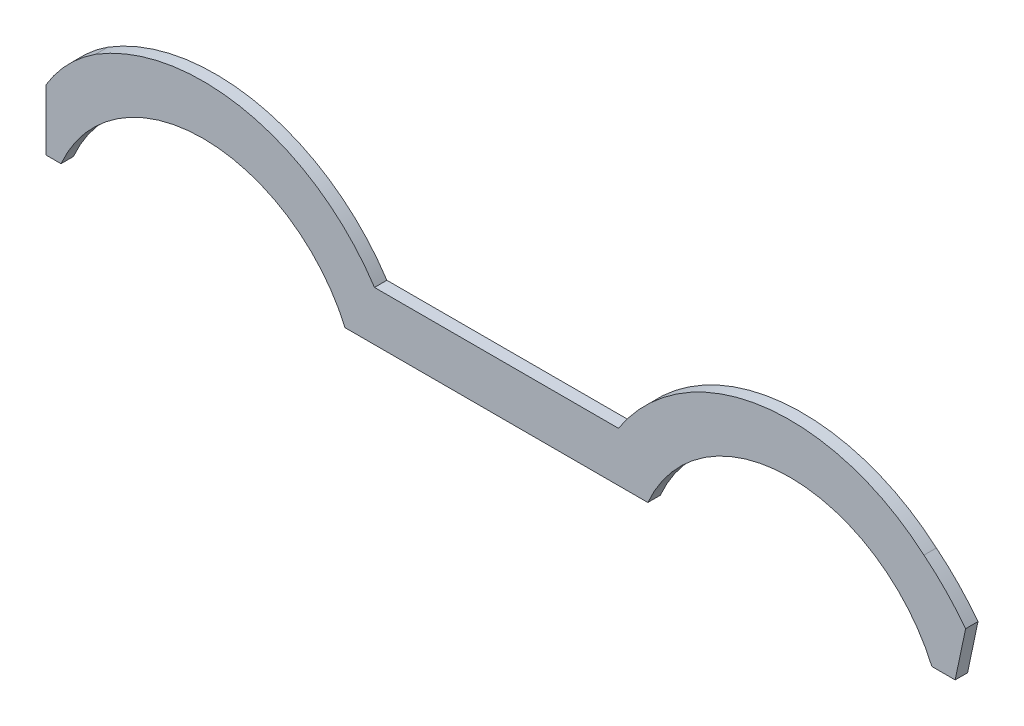
ISO-10303-21;
HEADER;
FILE_DESCRIPTION(('STEP AP214'),'2;1');
FILE_NAME('part.step','',(''),(''),'','','');
FILE_SCHEMA(('AUTOMOTIVE_DESIGN { 1 0 10303 214 1 1 1 1 }'));
ENDSEC;
DATA;
#1=APPLICATION_CONTEXT('core data for automotive mechanical design processes');
#2=APPLICATION_PROTOCOL_DEFINITION('international standard','automotive_design',2000,#1);
#3=PRODUCT_CONTEXT('',#1,'mechanical');
#4=PRODUCT('Part','Part','',(#3));
#5=PRODUCT_RELATED_PRODUCT_CATEGORY('part','',(#4));
#6=PRODUCT_DEFINITION_FORMATION('','',#4);
#7=PRODUCT_DEFINITION_CONTEXT('part definition',#1,'design');
#8=PRODUCT_DEFINITION('design','',#6,#7);
#9=PRODUCT_DEFINITION_SHAPE('','',#8);
#10=(LENGTH_UNIT() NAMED_UNIT(*) SI_UNIT(.MILLI.,.METRE.));
#11=(NAMED_UNIT(*) PLANE_ANGLE_UNIT() SI_UNIT($,.RADIAN.));
#12=(NAMED_UNIT(*) SI_UNIT($,.STERADIAN.) SOLID_ANGLE_UNIT());
#13=UNCERTAINTY_MEASURE_WITH_UNIT(LENGTH_MEASURE(1.E-05),#10,'distance_accuracy_value','');
#14=(GEOMETRIC_REPRESENTATION_CONTEXT(3) GLOBAL_UNCERTAINTY_ASSIGNED_CONTEXT((#13)) GLOBAL_UNIT_ASSIGNED_CONTEXT((#10,
#11,#12)) REPRESENTATION_CONTEXT('',''));
#15=CARTESIAN_POINT('',(0.,0.,0.));
#16=DIRECTION('',(0.,0.,1.));
#17=DIRECTION('',(1.,0.,0.));
#18=AXIS2_PLACEMENT_3D('',#15,#16,#17);
#19=CARTESIAN_POINT('',(-187.525673187149,-4.70490413530697,3.));
#20=DIRECTION('',(0.,0.,-1.));
#21=DIRECTION('',(-1.,0.,0.));
#22=AXIS2_PLACEMENT_3D('',#19,#20,#21);
#23=CYLINDRICAL_SURFACE('',#22,37.8436276046482);
#24=CARTESIAN_POINT('',(-187.525673187149,-4.70490413530697,0.));
#25=DIRECTION('',(0.,0.,1.));
#26=DIRECTION('',(1.,0.,0.));
#27=AXIS2_PLACEMENT_3D('',#24,#25,#26);
#28=CIRCLE('',#27,37.8436276046482);
#29=CARTESIAN_POINT('',(-208.,27.1218470630147,0.));
#30=VERTEX_POINT('',#29);
#31=CARTESIAN_POINT('',(-220.,14.7259540117603,0.));
#32=VERTEX_POINT('',#31);
#33=EDGE_CURVE('E159',#30,#32,#28,.T.);
#34=ORIENTED_EDGE('',*,*,#33,.T.);
#35=DIRECTION('',(0.,0.,-1.));
#36=VECTOR('',#35,1.);
#37=CARTESIAN_POINT('',(-220.,14.7259540117603,3.));
#38=LINE('',#37,#36);
#39=CARTESIAN_POINT('',(-220.,14.7259540117603,3.));
#40=VERTEX_POINT('',#39);
#41=EDGE_CURVE('E11',#40,#32,#38,.T.);
#42=ORIENTED_EDGE('',*,*,#41,.F.);
#43=CARTESIAN_POINT('',(-187.525673187149,-4.70490413530697,3.));
#44=DIRECTION('',(0.,0.,1.));
#45=DIRECTION('',(1.,0.,0.));
#46=AXIS2_PLACEMENT_3D('',#43,#44,#45);
#47=CIRCLE('',#46,37.8436276046482);
#48=CARTESIAN_POINT('',(-208.,27.1218470630147,3.));
#49=VERTEX_POINT('',#48);
#50=EDGE_CURVE('E181',#49,#40,#47,.T.);
#51=ORIENTED_EDGE('',*,*,#50,.F.);
#52=DIRECTION('',(0.,0.,-1.));
#53=VECTOR('',#52,1.);
#54=CARTESIAN_POINT('',(-208.,27.1218470630147,3.));
#55=LINE('',#54,#53);
#56=EDGE_CURVE('E155',#49,#30,#55,.T.);
#57=ORIENTED_EDGE('',*,*,#56,.T.);
#58=EDGE_LOOP('',(#34,#42,#51,#57));
#59=FACE_BOUND('',#58,.T.);
#60=ADVANCED_FACE('F39',(#59),#23,.T.);
#61=CARTESIAN_POINT('',(-220.,0.,3.));
#62=DIRECTION('',(1.,0.,0.));
#63=DIRECTION('',(0.,0.,-1.));
#64=AXIS2_PLACEMENT_3D('',#61,#62,#63);
#65=PLANE('',#64);
#66=DIRECTION('',(0.,-1.,0.));
#67=VECTOR('',#66,1.);
#68=CARTESIAN_POINT('',(-220.,0.,0.));
#69=LINE('',#68,#67);
#70=CARTESIAN_POINT('',(-220.,0.,0.));
#71=VERTEX_POINT('',#70);
#72=EDGE_CURVE('E162',#32,#71,#69,.T.);
#73=ORIENTED_EDGE('',*,*,#72,.T.);
#74=DIRECTION('',(0.,0.,-1.));
#75=VECTOR('',#74,1.);
#76=CARTESIAN_POINT('',(-220.,0.,3.));
#77=LINE('',#76,#75);
#78=CARTESIAN_POINT('',(-220.,0.,3.));
#79=VERTEX_POINT('',#78);
#80=EDGE_CURVE('E47',#79,#71,#77,.T.);
#81=ORIENTED_EDGE('',*,*,#80,.F.);
#82=DIRECTION('',(0.,-1.,0.));
#83=VECTOR('',#82,1.);
#84=CARTESIAN_POINT('',(-220.,0.,3.));
#85=LINE('',#84,#83);
#86=EDGE_CURVE('E110',#40,#79,#85,.T.);
#87=ORIENTED_EDGE('',*,*,#86,.F.);
#88=ORIENTED_EDGE('',*,*,#41,.T.);
#89=EDGE_LOOP('',(#73,#81,#87,#88));
#90=FACE_BOUND('',#89,.T.);
#91=ADVANCED_FACE('F259',(#90),#65,.F.);
#92=CARTESIAN_POINT('',(-216.369317712169,0.,3.));
#93=DIRECTION('',(0.,1.,0.));
#94=DIRECTION('',(-1.,0.,0.));
#95=AXIS2_PLACEMENT_3D('',#92,#93,#94);
#96=PLANE('',#95);
#97=DIRECTION('',(1.,0.,0.));
#98=VECTOR('',#97,1.);
#99=CARTESIAN_POINT('',(-216.369317712169,0.,0.));
#100=LINE('',#99,#98);
#101=CARTESIAN_POINT('',(-216.369317712169,0.,0.));
#102=VERTEX_POINT('',#101);
#103=EDGE_CURVE('E164',#71,#102,#100,.T.);
#104=ORIENTED_EDGE('',*,*,#103,.T.);
#105=DIRECTION('',(0.,0.,-1.));
#106=VECTOR('',#105,1.);
#107=CARTESIAN_POINT('',(-216.369317712169,0.,3.));
#108=LINE('',#107,#106);
#109=CARTESIAN_POINT('',(-216.369317712169,0.,3.));
#110=VERTEX_POINT('',#109);
#111=EDGE_CURVE('E200',#110,#102,#108,.T.);
#112=ORIENTED_EDGE('',*,*,#111,.F.);
#113=DIRECTION('',(1.,0.,0.));
#114=VECTOR('',#113,1.);
#115=CARTESIAN_POINT('',(-216.369317712169,0.,3.));
#116=LINE('',#115,#114);
#117=EDGE_CURVE('E208',#79,#110,#116,.T.);
#118=ORIENTED_EDGE('',*,*,#117,.F.);
#119=ORIENTED_EDGE('',*,*,#80,.T.);
#120=EDGE_LOOP('',(#104,#112,#118,#119));
#121=FACE_BOUND('',#120,.T.);
#122=ADVANCED_FACE('F206',(#121),#96,.F.);
#123=CARTESIAN_POINT('',(-182.,-15.,3.));
#124=DIRECTION('',(0.,0.,-1.));
#125=DIRECTION('',(-1.,0.,0.));
#126=AXIS2_PLACEMENT_3D('',#123,#124,#125);
#127=CYLINDRICAL_SURFACE('',#126,37.5);
#128=CARTESIAN_POINT('',(-182.,-15.,0.));
#129=DIRECTION('',(0.,0.,-1.));
#130=DIRECTION('',(1.,0.,0.));
#131=AXIS2_PLACEMENT_3D('',#128,#129,#130);
#132=CIRCLE('',#131,37.5);
#133=CARTESIAN_POINT('',(-147.630682287831,0.,0.));
#134=VERTEX_POINT('',#133);
#135=EDGE_CURVE('E166',#102,#134,#132,.T.);
#136=ORIENTED_EDGE('',*,*,#135,.T.);
#137=DIRECTION('',(0.,0.,-1.));
#138=VECTOR('',#137,1.);
#139=CARTESIAN_POINT('',(-147.630682287831,0.,3.));
#140=LINE('',#139,#138);
#141=CARTESIAN_POINT('',(-147.630682287831,0.,3.));
#142=VERTEX_POINT('',#141);
#143=EDGE_CURVE('E197',#142,#134,#140,.T.);
#144=ORIENTED_EDGE('',*,*,#143,.F.);
#145=CARTESIAN_POINT('',(-182.,-15.,3.));
#146=DIRECTION('',(0.,0.,-1.));
#147=DIRECTION('',(1.,0.,0.));
#148=AXIS2_PLACEMENT_3D('',#145,#146,#147);
#149=CIRCLE('',#148,37.5);
#150=EDGE_CURVE('E226',#110,#142,#149,.T.);
#151=ORIENTED_EDGE('',*,*,#150,.F.);
#152=ORIENTED_EDGE('',*,*,#111,.T.);
#153=EDGE_LOOP('',(#136,#144,#151,#152));
#154=FACE_BOUND('',#153,.T.);
#155=ADVANCED_FACE('F217',(#154),#127,.F.);
#156=CARTESIAN_POINT('',(-74.3693177121688,0.,3.));
#157=DIRECTION('',(0.,1.,0.));
#158=DIRECTION('',(-1.,0.,0.));
#159=AXIS2_PLACEMENT_3D('',#156,#157,#158);
#160=PLANE('',#159);
#161=DIRECTION('',(1.,0.,0.));
#162=VECTOR('',#161,1.);
#163=CARTESIAN_POINT('',(-74.3693177121688,0.,0.));
#164=LINE('',#163,#162);
#165=CARTESIAN_POINT('',(-74.3693177121688,0.,0.));
#166=VERTEX_POINT('',#165);
#167=EDGE_CURVE('E168',#134,#166,#164,.T.);
#168=ORIENTED_EDGE('',*,*,#167,.T.);
#169=DIRECTION('',(0.,0.,-1.));
#170=VECTOR('',#169,1.);
#171=CARTESIAN_POINT('',(-74.3693177121688,0.,3.));
#172=LINE('',#171,#170);
#173=CARTESIAN_POINT('',(-74.3693177121688,0.,3.));
#174=VERTEX_POINT('',#173);
#175=EDGE_CURVE('E194',#174,#166,#172,.T.);
#176=ORIENTED_EDGE('',*,*,#175,.F.);
#177=DIRECTION('',(1.,0.,0.));
#178=VECTOR('',#177,1.);
#179=CARTESIAN_POINT('',(-74.3693177121688,0.,3.));
#180=LINE('',#179,#178);
#181=EDGE_CURVE('E223',#142,#174,#180,.T.);
#182=ORIENTED_EDGE('',*,*,#181,.F.);
#183=ORIENTED_EDGE('',*,*,#143,.T.);
#184=EDGE_LOOP('',(#168,#176,#182,#183));
#185=FACE_BOUND('',#184,.T.);
#186=ADVANCED_FACE('F221',(#185),#160,.F.);
#187=CARTESIAN_POINT('',(-40.,-15.,3.));
#188=DIRECTION('',(0.,0.,-1.));
#189=DIRECTION('',(-1.,0.,0.));
#190=AXIS2_PLACEMENT_3D('',#187,#188,#189);
#191=CYLINDRICAL_SURFACE('',#190,37.5);
#192=CARTESIAN_POINT('',(-40.,-15.,0.));
#193=DIRECTION('',(0.,0.,-1.));
#194=DIRECTION('',(1.,0.,0.));
#195=AXIS2_PLACEMENT_3D('',#192,#193,#194);
#196=CIRCLE('',#195,37.5);
#197=CARTESIAN_POINT('',(-5.63068228783117,0.,0.));
#198=VERTEX_POINT('',#197);
#199=EDGE_CURVE('E170',#166,#198,#196,.T.);
#200=ORIENTED_EDGE('',*,*,#199,.T.);
#201=DIRECTION('',(0.,0.,-1.));
#202=VECTOR('',#201,1.);
#203=CARTESIAN_POINT('',(-5.63068228783117,0.,3.));
#204=LINE('',#203,#202);
#205=CARTESIAN_POINT('',(-5.63068228783117,0.,3.));
#206=VERTEX_POINT('',#205);
#207=EDGE_CURVE('E191',#206,#198,#204,.T.);
#208=ORIENTED_EDGE('',*,*,#207,.F.);
#209=CARTESIAN_POINT('',(-40.,-15.,3.));
#210=DIRECTION('',(0.,0.,-1.));
#211=DIRECTION('',(1.,0.,0.));
#212=AXIS2_PLACEMENT_3D('',#209,#210,#211);
#213=CIRCLE('',#212,37.5);
#214=EDGE_CURVE('E225',#174,#206,#213,.T.);
#215=ORIENTED_EDGE('',*,*,#214,.F.);
#216=ORIENTED_EDGE('',*,*,#175,.T.);
#217=EDGE_LOOP('',(#200,#208,#215,#216));
#218=FACE_BOUND('',#217,.T.);
#219=ADVANCED_FACE('F272',(#218),#191,.F.);
#220=CARTESIAN_POINT('',(-5.63068228783117,0.,3.));
#221=DIRECTION('',(0.,1.,0.));
#222=DIRECTION('',(0.,0.,1.));
#223=AXIS2_PLACEMENT_3D('',#220,#221,#222);
#224=PLANE('',#223);
#225=DIRECTION('',(1.,0.,0.));
#226=VECTOR('',#225,1.);
#227=CARTESIAN_POINT('',(-5.63068228783117,0.,0.));
#228=LINE('',#227,#226);
#229=CARTESIAN_POINT('',(0.,0.,0.));
#230=VERTEX_POINT('',#229);
#231=EDGE_CURVE('E172',#198,#230,#228,.T.);
#232=ORIENTED_EDGE('',*,*,#231,.T.);
#233=DIRECTION('',(0.,0.,-1.));
#234=VECTOR('',#233,1.);
#235=CARTESIAN_POINT('',(0.,0.,3.));
#236=LINE('',#235,#234);
#237=CARTESIAN_POINT('',(0.,0.,3.));
#238=VERTEX_POINT('',#237);
#239=EDGE_CURVE('E188',#238,#230,#236,.T.);
#240=ORIENTED_EDGE('',*,*,#239,.F.);
#241=DIRECTION('',(1.,0.,0.));
#242=VECTOR('',#241,1.);
#243=CARTESIAN_POINT('',(-5.63068228783117,0.,3.));
#244=LINE('',#243,#242);
#245=EDGE_CURVE('E228',#206,#238,#244,.T.);
#246=ORIENTED_EDGE('',*,*,#245,.F.);
#247=ORIENTED_EDGE('',*,*,#207,.T.);
#248=EDGE_LOOP('',(#232,#240,#246,#247));
#249=FACE_BOUND('',#248,.T.);
#250=ADVANCED_FACE('F275',(#249),#224,.F.);
#251=CARTESIAN_POINT('',(0.,0.,3.));
#252=DIRECTION('',(-0.978525064775294,0.20612786712744,0.));
#253=DIRECTION('',(-0.20612786712744,-0.978525064775294,0.));
#254=AXIS2_PLACEMENT_3D('',#251,#252,#253);
#255=PLANE('',#254);
#256=DIRECTION('',(0.20612786712744,0.978525064775294,0.));
#257=VECTOR('',#256,1.);
#258=CARTESIAN_POINT('',(0.,0.,0.));
#259=LINE('',#258,#257);
#260=CARTESIAN_POINT('',(2.52781915821164,12.,0.));
#261=VERTEX_POINT('',#260);
#262=EDGE_CURVE('E174',#230,#261,#259,.T.);
#263=ORIENTED_EDGE('',*,*,#262,.T.);
#264=DIRECTION('',(0.,0.,-1.));
#265=VECTOR('',#264,1.);
#266=CARTESIAN_POINT('',(2.52781915821164,12.,3.));
#267=LINE('',#266,#265);
#268=CARTESIAN_POINT('',(2.52781915821164,12.,3.));
#269=VERTEX_POINT('',#268);
#270=EDGE_CURVE('E185',#269,#261,#267,.T.);
#271=ORIENTED_EDGE('',*,*,#270,.F.);
#272=DIRECTION('',(0.20612786712744,0.978525064775294,0.));
#273=VECTOR('',#272,1.);
#274=CARTESIAN_POINT('',(0.,0.,3.));
#275=LINE('',#274,#273);
#276=EDGE_CURVE('E234',#238,#269,#275,.T.);
#277=ORIENTED_EDGE('',*,*,#276,.F.);
#278=ORIENTED_EDGE('',*,*,#239,.T.);
#279=EDGE_LOOP('',(#263,#271,#277,#278));
#280=FACE_BOUND('',#279,.T.);
#281=ADVANCED_FACE('F240',(#280),#255,.F.);
#282=CARTESIAN_POINT('',(-44.9702334529333,-24.0343196837824,3.));
#283=DIRECTION('',(0.,0.,-1.));
#284=DIRECTION('',(-1.,0.,0.));
#285=AXIS2_PLACEMENT_3D('',#282,#283,#284);
#286=CYLINDRICAL_SURFACE('',#285,59.6199395917516);
#287=CARTESIAN_POINT('',(-44.9702334529333,-24.0343196837824,0.));
#288=DIRECTION('',(0.,0.,1.));
#289=DIRECTION('',(-1.,0.,0.));
#290=AXIS2_PLACEMENT_3D('',#287,#288,#289);
#291=CIRCLE('',#290,59.6199395917516);
#292=CARTESIAN_POINT('',(-7.54917120365112,22.3790544346705,0.));
#293=VERTEX_POINT('',#292);
#294=EDGE_CURVE('E176',#261,#293,#291,.T.);
#295=ORIENTED_EDGE('',*,*,#294,.T.);
#296=DIRECTION('',(0.,0.,-1.));
#297=VECTOR('',#296,1.);
#298=CARTESIAN_POINT('',(-7.54917120365112,22.3790544346705,3.));
#299=LINE('',#298,#297);
#300=CARTESIAN_POINT('',(-7.54917120365112,22.3790544346705,3.));
#301=VERTEX_POINT('',#300);
#302=EDGE_CURVE('E150',#301,#293,#299,.T.);
#303=ORIENTED_EDGE('',*,*,#302,.F.);
#304=CARTESIAN_POINT('',(-44.9702334529333,-24.0343196837824,3.));
#305=DIRECTION('',(0.,0.,1.));
#306=DIRECTION('',(-1.,0.,0.));
#307=AXIS2_PLACEMENT_3D('',#304,#305,#306);
#308=CIRCLE('',#307,59.6199395917516);
#309=EDGE_CURVE('E141',#269,#301,#308,.T.);
#310=ORIENTED_EDGE('',*,*,#309,.F.);
#311=ORIENTED_EDGE('',*,*,#270,.T.);
#312=EDGE_LOOP('',(#295,#303,#310,#311));
#313=FACE_BOUND('',#312,.T.);
#314=ADVANCED_FACE('F244',(#313),#286,.T.);
#315=CARTESIAN_POINT('',(-40.,-15.,3.));
#316=DIRECTION('',(0.,0.,-1.));
#317=DIRECTION('',(-1.,0.,0.));
#318=AXIS2_PLACEMENT_3D('',#315,#316,#317);
#319=CYLINDRICAL_SURFACE('',#318,49.5);
#320=CARTESIAN_POINT('',(-40.,-15.,0.));
#321=DIRECTION('',(0.,0.,1.));
#322=DIRECTION('',(1.,0.,0.));
#323=AXIS2_PLACEMENT_3D('',#320,#321,#322);
#324=CIRCLE('',#323,49.5);
#325=CARTESIAN_POINT('',(-81.487950057818,12.,0.));
#326=VERTEX_POINT('',#325);
#327=EDGE_CURVE('E149',#293,#326,#324,.T.);
#328=ORIENTED_EDGE('',*,*,#327,.T.);
#329=DIRECTION('',(0.,0.,-1.));
#330=VECTOR('',#329,1.);
#331=CARTESIAN_POINT('',(-81.487950057818,12.,3.));
#332=LINE('',#331,#330);
#333=CARTESIAN_POINT('',(-81.487950057818,12.,3.));
#334=VERTEX_POINT('',#333);
#335=EDGE_CURVE('E146',#334,#326,#332,.T.);
#336=ORIENTED_EDGE('',*,*,#335,.F.);
#337=CARTESIAN_POINT('',(-40.,-15.,3.));
#338=DIRECTION('',(0.,0.,1.));
#339=DIRECTION('',(1.,0.,0.));
#340=AXIS2_PLACEMENT_3D('',#337,#338,#339);
#341=CIRCLE('',#340,49.5);
#342=EDGE_CURVE('E135',#301,#334,#341,.T.);
#343=ORIENTED_EDGE('',*,*,#342,.F.);
#344=ORIENTED_EDGE('',*,*,#302,.T.);
#345=EDGE_LOOP('',(#328,#336,#343,#344));
#346=FACE_BOUND('',#345,.T.);
#347=ADVANCED_FACE('F147',(#346),#319,.T.);
#348=CARTESIAN_POINT('',(-140.512049942182,12.,3.));
#349=DIRECTION('',(0.,-1.,0.));
#350=DIRECTION('',(0.,0.,-1.));
#351=AXIS2_PLACEMENT_3D('',#348,#349,#350);
#352=PLANE('',#351);
#353=DIRECTION('',(-1.,0.,0.));
#354=VECTOR('',#353,1.);
#355=CARTESIAN_POINT('',(-140.512049942182,12.,0.));
#356=LINE('',#355,#354);
#357=CARTESIAN_POINT('',(-140.512049942182,12.,0.));
#358=VERTEX_POINT('',#357);
#359=EDGE_CURVE('E96',#326,#358,#356,.T.);
#360=ORIENTED_EDGE('',*,*,#359,.T.);
#361=DIRECTION('',(0.,0.,-1.));
#362=VECTOR('',#361,1.);
#363=CARTESIAN_POINT('',(-140.512049942182,12.,3.));
#364=LINE('',#363,#362);
#365=CARTESIAN_POINT('',(-140.512049942182,12.,3.));
#366=VERTEX_POINT('',#365);
#367=EDGE_CURVE('E151',#366,#358,#364,.T.);
#368=ORIENTED_EDGE('',*,*,#367,.F.);
#369=DIRECTION('',(-1.,0.,0.));
#370=VECTOR('',#369,1.);
#371=CARTESIAN_POINT('',(-140.512049942182,12.,3.));
#372=LINE('',#371,#370);
#373=EDGE_CURVE('E139',#334,#366,#372,.T.);
#374=ORIENTED_EDGE('',*,*,#373,.F.);
#375=ORIENTED_EDGE('',*,*,#335,.T.);
#376=EDGE_LOOP('',(#360,#368,#374,#375));
#377=FACE_BOUND('',#376,.T.);
#378=ADVANCED_FACE('F153',(#377),#352,.F.);
#379=CARTESIAN_POINT('',(-182.,-15.,3.));
#380=DIRECTION('',(0.,0.,-1.));
#381=DIRECTION('',(-1.,0.,0.));
#382=AXIS2_PLACEMENT_3D('',#379,#380,#381);
#383=CYLINDRICAL_SURFACE('',#382,49.5);
#384=CARTESIAN_POINT('',(-182.,-15.,0.));
#385=DIRECTION('',(0.,0.,1.));
#386=DIRECTION('',(1.,0.,0.));
#387=AXIS2_PLACEMENT_3D('',#384,#385,#386);
#388=CIRCLE('',#387,49.5);
#389=EDGE_CURVE('E102',#358,#30,#388,.T.);
#390=ORIENTED_EDGE('',*,*,#389,.T.);
#391=ORIENTED_EDGE('',*,*,#56,.F.);
#392=CARTESIAN_POINT('',(-182.,-15.,3.));
#393=DIRECTION('',(0.,0.,1.));
#394=DIRECTION('',(1.,0.,0.));
#395=AXIS2_PLACEMENT_3D('',#392,#393,#394);
#396=CIRCLE('',#395,49.5);
#397=EDGE_CURVE('E55',#366,#49,#396,.T.);
#398=ORIENTED_EDGE('',*,*,#397,.F.);
#399=ORIENTED_EDGE('',*,*,#367,.T.);
#400=EDGE_LOOP('',(#390,#391,#398,#399));
#401=FACE_BOUND('',#400,.T.);
#402=ADVANCED_FACE('F248',(#401),#383,.T.);
#403=CARTESIAN_POINT('',(-187.525673187149,-4.70490413530697,3.));
#404=DIRECTION('',(0.,0.,1.));
#405=DIRECTION('',(1.,0.,0.));
#406=AXIS2_PLACEMENT_3D('',#403,#404,#405);
#407=PLANE('',#406);
#408=ORIENTED_EDGE('',*,*,#50,.T.);
#409=ORIENTED_EDGE('',*,*,#86,.T.);
#410=ORIENTED_EDGE('',*,*,#117,.T.);
#411=ORIENTED_EDGE('',*,*,#150,.T.);
#412=ORIENTED_EDGE('',*,*,#181,.T.);
#413=ORIENTED_EDGE('',*,*,#214,.T.);
#414=ORIENTED_EDGE('',*,*,#245,.T.);
#415=ORIENTED_EDGE('',*,*,#276,.T.);
#416=ORIENTED_EDGE('',*,*,#309,.T.);
#417=ORIENTED_EDGE('',*,*,#342,.T.);
#418=ORIENTED_EDGE('',*,*,#373,.T.);
#419=ORIENTED_EDGE('',*,*,#397,.T.);
#420=EDGE_LOOP('',(#408,#409,#410,#411,#412,#413,#414,#415,#416,#417,#418,#419));
#421=FACE_BOUND('',#420,.T.);
#422=ADVANCED_FACE('F137',(#421),#407,.T.);
#423=CARTESIAN_POINT('',(-187.525673187149,-4.70490413530697,0.));
#424=DIRECTION('',(0.,0.,1.));
#425=DIRECTION('',(1.,0.,0.));
#426=AXIS2_PLACEMENT_3D('',#423,#424,#425);
#427=PLANE('',#426);
#428=ORIENTED_EDGE('',*,*,#33,.F.);
#429=ORIENTED_EDGE('',*,*,#389,.F.);
#430=ORIENTED_EDGE('',*,*,#359,.F.);
#431=ORIENTED_EDGE('',*,*,#327,.F.);
#432=ORIENTED_EDGE('',*,*,#294,.F.);
#433=ORIENTED_EDGE('',*,*,#262,.F.);
#434=ORIENTED_EDGE('',*,*,#231,.F.);
#435=ORIENTED_EDGE('',*,*,#199,.F.);
#436=ORIENTED_EDGE('',*,*,#167,.F.);
#437=ORIENTED_EDGE('',*,*,#135,.F.);
#438=ORIENTED_EDGE('',*,*,#103,.F.);
#439=ORIENTED_EDGE('',*,*,#72,.F.);
#440=EDGE_LOOP('',(#428,#429,#430,#431,#432,#433,#434,#435,#436,#437,#438,#439));
#441=FACE_BOUND('',#440,.T.);
#442=ADVANCED_FACE('F212',(#441),#427,.F.);
#443=CLOSED_SHELL('',(#60,#91,#122,#155,#186,#219,#250,#281,#314,#347,#378,#402,#422,#442));
#444=MANIFOLD_SOLID_BREP('B2',#443);
#445=ADVANCED_BREP_SHAPE_REPRESENTATION('',(#18,#444),#14);
#446=SHAPE_DEFINITION_REPRESENTATION(#9,#445);
ENDSEC;
END-ISO-10303-21;
